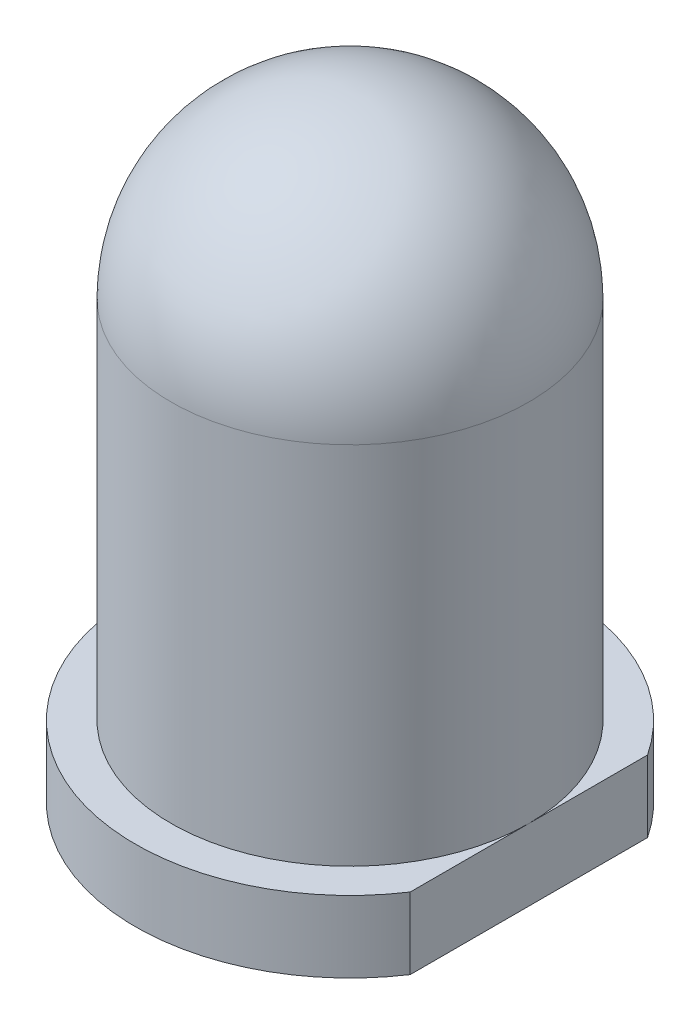
ISO-10303-21;
HEADER;
FILE_DESCRIPTION(('STEP AP214'),'2;1');
FILE_NAME('part.step','',(''),(''),'','','');
FILE_SCHEMA(('AUTOMOTIVE_DESIGN { 1 0 10303 214 1 1 1 1 }'));
ENDSEC;
DATA;
#1=APPLICATION_CONTEXT('core data for automotive mechanical design processes');
#2=APPLICATION_PROTOCOL_DEFINITION('international standard','automotive_design',2000,#1);
#3=PRODUCT_CONTEXT('',#1,'mechanical');
#4=PRODUCT('Part','Part','',(#3));
#5=PRODUCT_RELATED_PRODUCT_CATEGORY('part','',(#4));
#6=PRODUCT_DEFINITION_FORMATION('','',#4);
#7=PRODUCT_DEFINITION_CONTEXT('part definition',#1,'design');
#8=PRODUCT_DEFINITION('design','',#6,#7);
#9=PRODUCT_DEFINITION_SHAPE('','',#8);
#10=(LENGTH_UNIT() NAMED_UNIT(*) SI_UNIT(.MILLI.,.METRE.));
#11=(NAMED_UNIT(*) PLANE_ANGLE_UNIT() SI_UNIT($,.RADIAN.));
#12=(NAMED_UNIT(*) SI_UNIT($,.STERADIAN.) SOLID_ANGLE_UNIT());
#13=UNCERTAINTY_MEASURE_WITH_UNIT(LENGTH_MEASURE(1.E-05),#10,'distance_accuracy_value','');
#14=(GEOMETRIC_REPRESENTATION_CONTEXT(3) GLOBAL_UNCERTAINTY_ASSIGNED_CONTEXT((#13)) GLOBAL_UNIT_ASSIGNED_CONTEXT((#10,
#11,#12)) REPRESENTATION_CONTEXT('',''));
#15=CARTESIAN_POINT('',(0.,0.,0.));
#16=DIRECTION('',(0.,0.,1.));
#17=DIRECTION('',(1.,0.,0.));
#18=AXIS2_PLACEMENT_3D('',#15,#16,#17);
#19=CARTESIAN_POINT('',(0.,8.6,0.));
#20=DIRECTION('',(0.,-1.,0.));
#21=DIRECTION('',(0.,0.,-1.));
#22=AXIS2_PLACEMENT_3D('',#19,#20,#21);
#23=CYLINDRICAL_SURFACE('',#22,2.5);
#24=CARTESIAN_POINT('',(0.,6.1,0.));
#25=DIRECTION('',(0.,-1.,0.));
#26=DIRECTION('',(0.,0.,-1.));
#27=AXIS2_PLACEMENT_3D('',#24,#25,#26);
#28=CIRCLE('',#27,2.5);
#29=CARTESIAN_POINT('',(0.,6.1,-2.5));
#30=VERTEX_POINT('',#29);
#31=EDGE_CURVE('E11',#30,#30,#28,.T.);
#32=ORIENTED_EDGE('',*,*,#31,.T.);
#33=EDGE_LOOP('',(#32));
#34=FACE_BOUND('',#33,.T.);
#35=CARTESIAN_POINT('',(0.,1.,0.));
#36=DIRECTION('',(0.,-1.,0.));
#37=DIRECTION('',(0.,0.,-1.));
#38=AXIS2_PLACEMENT_3D('',#35,#36,#37);
#39=CIRCLE('',#38,2.5);
#40=CARTESIAN_POINT('',(2.5,1.,0.));
#41=VERTEX_POINT('',#40);
#42=EDGE_CURVE('E69',#41,#41,#39,.T.);
#43=ORIENTED_EDGE('',*,*,#42,.F.);
#44=EDGE_LOOP('',(#43));
#45=FACE_BOUND('',#44,.T.);
#46=ADVANCED_FACE('F35',(#34,#45),#23,.T.);
#47=CARTESIAN_POINT('',(0.,1.,0.));
#48=DIRECTION('',(0.,-1.,0.));
#49=DIRECTION('',(0.,0.,-1.));
#50=AXIS2_PLACEMENT_3D('',#47,#48,#49);
#51=CYLINDRICAL_SURFACE('',#50,3.);
#52=DIRECTION('',(0.,-1.,0.));
#53=VECTOR('',#52,1.);
#54=CARTESIAN_POINT('',(2.5,1.,-1.6583123951777));
#55=LINE('',#54,#53);
#56=CARTESIAN_POINT('',(2.5,0.,-1.6583123951777));
#57=VERTEX_POINT('',#56);
#58=CARTESIAN_POINT('',(2.5,1.,-1.6583123951777));
#59=VERTEX_POINT('',#58);
#60=EDGE_CURVE('E64',#57,#59,#55,.F.);
#61=ORIENTED_EDGE('',*,*,#60,.F.);
#62=CARTESIAN_POINT('',(0.,0.,0.));
#63=DIRECTION('',(0.,-1.,0.));
#64=DIRECTION('',(0.,0.,-1.));
#65=AXIS2_PLACEMENT_3D('',#62,#63,#64);
#66=CIRCLE('',#65,3.);
#67=CARTESIAN_POINT('',(2.5,0.,1.6583123951777));
#68=VERTEX_POINT('',#67);
#69=EDGE_CURVE('E73',#68,#57,#66,.T.);
#70=ORIENTED_EDGE('',*,*,#69,.F.);
#71=DIRECTION('',(0.,-1.,0.));
#72=VECTOR('',#71,1.);
#73=CARTESIAN_POINT('',(2.5,1.,1.6583123951777));
#74=LINE('',#73,#72);
#75=CARTESIAN_POINT('',(2.5,1.,1.6583123951777));
#76=VERTEX_POINT('',#75);
#77=EDGE_CURVE('E50',#76,#68,#74,.T.);
#78=ORIENTED_EDGE('',*,*,#77,.F.);
#79=CARTESIAN_POINT('',(0.,1.,0.));
#80=DIRECTION('',(0.,-1.,0.));
#81=DIRECTION('',(0.,0.,-1.));
#82=AXIS2_PLACEMENT_3D('',#79,#80,#81);
#83=CIRCLE('',#82,3.);
#84=EDGE_CURVE('E75',#76,#59,#83,.T.);
#85=ORIENTED_EDGE('',*,*,#84,.T.);
#86=EDGE_LOOP('',(#61,#70,#78,#85));
#87=FACE_BOUND('',#86,.T.);
#88=ADVANCED_FACE('F72',(#87),#51,.T.);
#89=CARTESIAN_POINT('',(0.,1.,0.));
#90=DIRECTION('',(0.,-1.,0.));
#91=DIRECTION('',(0.,0.,-1.));
#92=AXIS2_PLACEMENT_3D('',#89,#90,#91);
#93=PLANE('',#92);
#94=ORIENTED_EDGE('',*,*,#84,.F.);
#95=DIRECTION('',(0.,0.,-1.));
#96=VECTOR('',#95,1.);
#97=CARTESIAN_POINT('',(2.5,1.,0.));
#98=LINE('',#97,#96);
#99=EDGE_CURVE('E55',#76,#41,#98,.T.);
#100=ORIENTED_EDGE('',*,*,#99,.T.);
#101=ORIENTED_EDGE('',*,*,#42,.T.);
#102=EDGE_CURVE('E85',#41,#59,#98,.T.);
#103=ORIENTED_EDGE('',*,*,#102,.T.);
#104=EDGE_LOOP('',(#94,#100,#101,#103));
#105=FACE_BOUND('',#104,.T.);
#106=ADVANCED_FACE('F84',(#105),#93,.F.);
#107=CARTESIAN_POINT('',(0.,0.,0.));
#108=DIRECTION('',(0.,1.,0.));
#109=DIRECTION('',(0.,0.,1.));
#110=AXIS2_PLACEMENT_3D('',#107,#108,#109);
#111=PLANE('',#110);
#112=ORIENTED_EDGE('',*,*,#69,.T.);
#113=DIRECTION('',(0.,0.,1.));
#114=VECTOR('',#113,1.);
#115=CARTESIAN_POINT('',(2.5,0.,0.));
#116=LINE('',#115,#114);
#117=EDGE_CURVE('E43',#57,#68,#116,.T.);
#118=ORIENTED_EDGE('',*,*,#117,.T.);
#119=EDGE_LOOP('',(#112,#118));
#120=FACE_BOUND('',#119,.T.);
#121=ADVANCED_FACE('F77',(#120),#111,.F.);
#122=CARTESIAN_POINT('',(2.5,8.6,-2.97810513588188));
#123=DIRECTION('',(-1.,0.,0.));
#124=DIRECTION('',(0.,0.,1.));
#125=AXIS2_PLACEMENT_3D('',#122,#123,#124);
#126=PLANE('',#125);
#127=ORIENTED_EDGE('',*,*,#60,.T.);
#128=ORIENTED_EDGE('',*,*,#102,.F.);
#129=ORIENTED_EDGE('',*,*,#99,.F.);
#130=ORIENTED_EDGE('',*,*,#77,.T.);
#131=ORIENTED_EDGE('',*,*,#117,.F.);
#132=EDGE_LOOP('',(#127,#128,#129,#130,#131));
#133=FACE_BOUND('',#132,.T.);
#134=ADVANCED_FACE('F63',(#133),#126,.F.);
#135=CARTESIAN_POINT('',(0.,6.1,0.));
#136=DIRECTION('',(0.,0.,1.));
#137=DIRECTION('',(1.,0.,0.));
#138=AXIS2_PLACEMENT_3D('',#135,#136,#137);
#139=SPHERICAL_SURFACE('',#138,2.5);
#140=CARTESIAN_POINT('',(0.,6.1,0.));
#141=DIRECTION('',(0.,-1.,0.));
#142=DIRECTION('',(0.,0.,-1.));
#143=AXIS2_PLACEMENT_3D('',#140,#141,#142);
#144=SPHERICAL_SURFACE('',#143,2.5);
#145=ORIENTED_EDGE('',*,*,#31,.F.);
#146=EDGE_LOOP('',(#145));
#147=FACE_BOUND('',#146,.T.);
#148=ADVANCED_FACE('F37',(#147),#144,.T.);
#149=CLOSED_SHELL('',(#46,#88,#106,#121,#134,#148));
#150=MANIFOLD_SOLID_BREP('B2',#149);
#151=ADVANCED_BREP_SHAPE_REPRESENTATION('',(#18,#150),#14);
#152=SHAPE_DEFINITION_REPRESENTATION(#9,#151);
ENDSEC;
END-ISO-10303-21;
